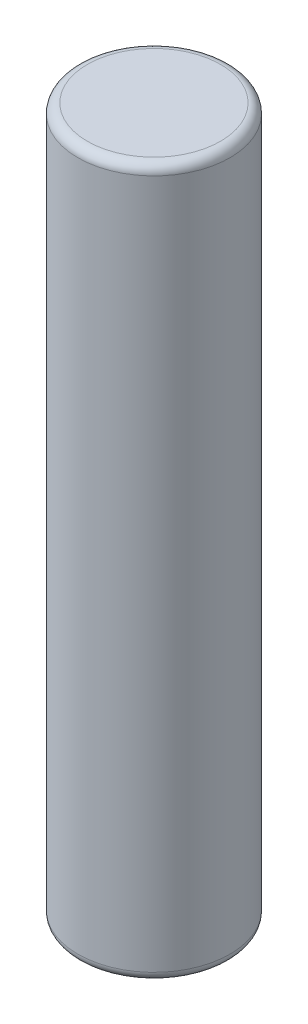
ISO-10303-21;
HEADER;
FILE_DESCRIPTION(('STEP AP214'),'2;1');
FILE_NAME('part.step','',(''),(''),'','','');
FILE_SCHEMA(('AUTOMOTIVE_DESIGN { 1 0 10303 214 1 1 1 1 }'));
ENDSEC;
DATA;
#1=APPLICATION_CONTEXT('core data for automotive mechanical design processes');
#2=APPLICATION_PROTOCOL_DEFINITION('international standard','automotive_design',2000,#1);
#3=PRODUCT_CONTEXT('',#1,'mechanical');
#4=PRODUCT('Part','Part','',(#3));
#5=PRODUCT_RELATED_PRODUCT_CATEGORY('part','',(#4));
#6=PRODUCT_DEFINITION_FORMATION('','',#4);
#7=PRODUCT_DEFINITION_CONTEXT('part definition',#1,'design');
#8=PRODUCT_DEFINITION('design','',#6,#7);
#9=PRODUCT_DEFINITION_SHAPE('','',#8);
#10=(LENGTH_UNIT() NAMED_UNIT(*) SI_UNIT(.MILLI.,.METRE.));
#11=(NAMED_UNIT(*) PLANE_ANGLE_UNIT() SI_UNIT($,.RADIAN.));
#12=(NAMED_UNIT(*) SI_UNIT($,.STERADIAN.) SOLID_ANGLE_UNIT());
#13=UNCERTAINTY_MEASURE_WITH_UNIT(LENGTH_MEASURE(1.E-05),#10,'distance_accuracy_value','');
#14=(GEOMETRIC_REPRESENTATION_CONTEXT(3) GLOBAL_UNCERTAINTY_ASSIGNED_CONTEXT((#13)) GLOBAL_UNIT_ASSIGNED_CONTEXT((#10,
#11,#12)) REPRESENTATION_CONTEXT('',''));
#15=CARTESIAN_POINT('',(0.,0.,0.));
#16=DIRECTION('',(0.,0.,1.));
#17=DIRECTION('',(1.,0.,0.));
#18=AXIS2_PLACEMENT_3D('',#15,#16,#17);
#19=CARTESIAN_POINT('',(0.,37.25,0.));
#20=DIRECTION('',(0.,-1.,0.));
#21=DIRECTION('',(0.,0.,-1.));
#22=AXIS2_PLACEMENT_3D('',#19,#20,#21);
#23=CYLINDRICAL_SURFACE('',#22,4.);
#24=CARTESIAN_POINT('',(0.,0.5,0.));
#25=DIRECTION('',(0.,1.,0.));
#26=DIRECTION('',(0.,0.,1.));
#27=AXIS2_PLACEMENT_3D('',#24,#25,#26);
#28=CIRCLE('',#27,4.);
#29=CARTESIAN_POINT('',(0.,0.5,4.));
#30=VERTEX_POINT('',#29);
#31=EDGE_CURVE('E49',#30,#30,#28,.T.);
#32=ORIENTED_EDGE('',*,*,#31,.T.);
#33=EDGE_LOOP('',(#32));
#34=FACE_BOUND('',#33,.T.);
#35=CARTESIAN_POINT('',(0.,36.75,0.));
#36=DIRECTION('',(0.,1.,0.));
#37=DIRECTION('',(0.,0.,1.));
#38=AXIS2_PLACEMENT_3D('',#35,#36,#37);
#39=CIRCLE('',#38,4.);
#40=CARTESIAN_POINT('',(0.,36.75,4.));
#41=VERTEX_POINT('',#40);
#42=EDGE_CURVE('E54',#41,#41,#39,.F.);
#43=ORIENTED_EDGE('',*,*,#42,.T.);
#44=EDGE_LOOP('',(#43));
#45=FACE_BOUND('',#44,.T.);
#46=ADVANCED_FACE('F36',(#34,#45),#23,.T.);
#47=CARTESIAN_POINT('',(0.,37.25,0.));
#48=DIRECTION('',(0.,1.,0.));
#49=DIRECTION('',(0.,0.,1.));
#50=AXIS2_PLACEMENT_3D('',#47,#48,#49);
#51=PLANE('',#50);
#52=CARTESIAN_POINT('',(0.,37.25,0.));
#53=DIRECTION('',(0.,1.,0.));
#54=DIRECTION('',(0.,0.,1.));
#55=AXIS2_PLACEMENT_3D('',#52,#53,#54);
#56=CIRCLE('',#55,3.5);
#57=CARTESIAN_POINT('',(0.,37.25,3.5));
#58=VERTEX_POINT('',#57);
#59=EDGE_CURVE('E10',#58,#58,#56,.T.);
#60=ORIENTED_EDGE('',*,*,#59,.T.);
#61=EDGE_LOOP('',(#60));
#62=FACE_BOUND('',#61,.T.);
#63=ADVANCED_FACE('F71',(#62),#51,.T.);
#64=CARTESIAN_POINT('',(0.,0.,0.));
#65=DIRECTION('',(0.,1.,0.));
#66=DIRECTION('',(0.,0.,1.));
#67=AXIS2_PLACEMENT_3D('',#64,#65,#66);
#68=PLANE('',#67);
#69=CARTESIAN_POINT('',(0.,0.,0.));
#70=DIRECTION('',(0.,1.,0.));
#71=DIRECTION('',(0.,0.,1.));
#72=AXIS2_PLACEMENT_3D('',#69,#70,#71);
#73=CIRCLE('',#72,3.5);
#74=CARTESIAN_POINT('',(0.,0.,3.5));
#75=VERTEX_POINT('',#74);
#76=EDGE_CURVE('E44',#75,#75,#73,.F.);
#77=ORIENTED_EDGE('',*,*,#76,.T.);
#78=EDGE_LOOP('',(#77));
#79=FACE_BOUND('',#78,.T.);
#80=ADVANCED_FACE('F68',(#79),#68,.F.);
#81=CARTESIAN_POINT('',(0.,0.5,0.));
#82=DIRECTION('',(0.,1.,0.));
#83=DIRECTION('',(0.,0.,1.));
#84=AXIS2_PLACEMENT_3D('',#81,#82,#83);
#85=TOROIDAL_SURFACE('',#84,3.5,0.5);
#86=ORIENTED_EDGE('',*,*,#76,.F.);
#87=EDGE_LOOP('',(#86));
#88=FACE_BOUND('',#87,.T.);
#89=ORIENTED_EDGE('',*,*,#31,.F.);
#90=EDGE_LOOP('',(#89));
#91=FACE_BOUND('',#90,.T.);
#92=ADVANCED_FACE('F64',(#88,#91),#85,.T.);
#93=CARTESIAN_POINT('',(0.,36.75,0.));
#94=DIRECTION('',(0.,1.,0.));
#95=DIRECTION('',(0.,0.,1.));
#96=AXIS2_PLACEMENT_3D('',#93,#94,#95);
#97=TOROIDAL_SURFACE('',#96,3.5,0.5);
#98=ORIENTED_EDGE('',*,*,#42,.F.);
#99=EDGE_LOOP('',(#98));
#100=FACE_BOUND('',#99,.T.);
#101=ORIENTED_EDGE('',*,*,#59,.F.);
#102=EDGE_LOOP('',(#101));
#103=FACE_BOUND('',#102,.T.);
#104=ADVANCED_FACE('F38',(#100,#103),#97,.T.);
#105=CLOSED_SHELL('',(#46,#63,#80,#92,#104));
#106=MANIFOLD_SOLID_BREP('B2',#105);
#107=ADVANCED_BREP_SHAPE_REPRESENTATION('',(#18,#106),#14);
#108=SHAPE_DEFINITION_REPRESENTATION(#9,#107);
ENDSEC;
END-ISO-10303-21;
